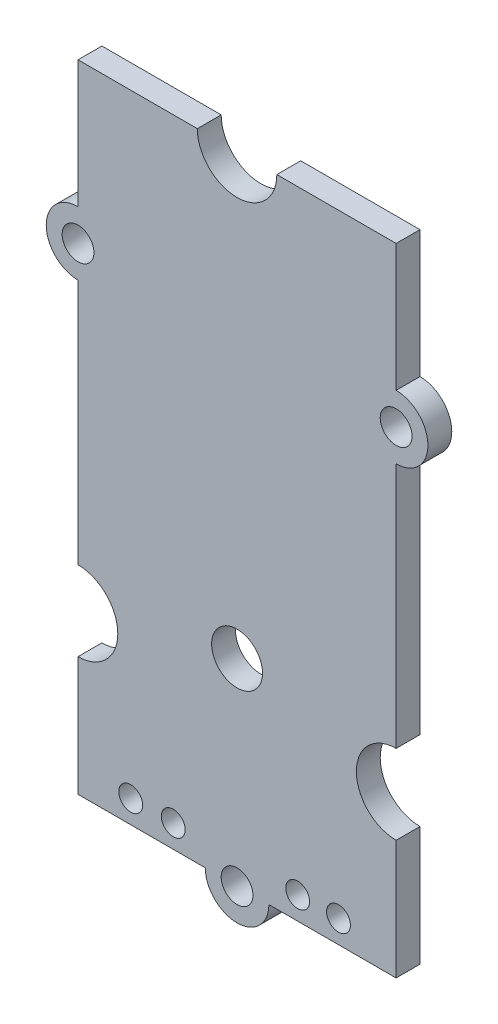
ISO-10303-21;
HEADER;
FILE_DESCRIPTION(('STEP AP214'),'2;1');
FILE_NAME('part.step','',(''),(''),'','','');
FILE_SCHEMA(('AUTOMOTIVE_DESIGN { 1 0 10303 214 1 1 1 1 }'));
ENDSEC;
DATA;
#1=APPLICATION_CONTEXT('core data for automotive mechanical design processes');
#2=APPLICATION_PROTOCOL_DEFINITION('international standard','automotive_design',2000,#1);
#3=PRODUCT_CONTEXT('',#1,'mechanical');
#4=PRODUCT('Part','Part','',(#3));
#5=PRODUCT_RELATED_PRODUCT_CATEGORY('part','',(#4));
#6=PRODUCT_DEFINITION_FORMATION('','',#4);
#7=PRODUCT_DEFINITION_CONTEXT('part definition',#1,'design');
#8=PRODUCT_DEFINITION('design','',#6,#7);
#9=PRODUCT_DEFINITION_SHAPE('','',#8);
#10=(LENGTH_UNIT() NAMED_UNIT(*) SI_UNIT(.MILLI.,.METRE.));
#11=(NAMED_UNIT(*) PLANE_ANGLE_UNIT() SI_UNIT($,.RADIAN.));
#12=(NAMED_UNIT(*) SI_UNIT($,.STERADIAN.) SOLID_ANGLE_UNIT());
#13=UNCERTAINTY_MEASURE_WITH_UNIT(LENGTH_MEASURE(1.E-05),#10,'distance_accuracy_value','');
#14=(GEOMETRIC_REPRESENTATION_CONTEXT(3) GLOBAL_UNCERTAINTY_ASSIGNED_CONTEXT((#13)) GLOBAL_UNIT_ASSIGNED_CONTEXT((#10,
#11,#12)) REPRESENTATION_CONTEXT('',''));
#15=CARTESIAN_POINT('',(0.,0.,0.));
#16=DIRECTION('',(0.,0.,1.));
#17=DIRECTION('',(1.,0.,0.));
#18=AXIS2_PLACEMENT_3D('',#15,#16,#17);
#19=CARTESIAN_POINT('',(-10.,0.,1.5));
#20=DIRECTION('',(1.,0.,0.));
#21=DIRECTION('',(0.,0.,-1.));
#22=AXIS2_PLACEMENT_3D('',#19,#20,#21);
#23=PLANE('',#22);
#24=DIRECTION('',(0.,-1.,0.));
#25=VECTOR('',#24,1.);
#26=CARTESIAN_POINT('',(-10.,0.,0.));
#27=LINE('',#26,#25);
#28=CARTESIAN_POINT('',(-10.,7.5,0.));
#29=VERTEX_POINT('',#28);
#30=CARTESIAN_POINT('',(-10.,0.,0.));
#31=VERTEX_POINT('',#30);
#32=EDGE_CURVE('E178',#29,#31,#27,.T.);
#33=ORIENTED_EDGE('',*,*,#32,.T.);
#34=DIRECTION('',(0.,0.,-1.));
#35=VECTOR('',#34,1.);
#36=CARTESIAN_POINT('',(-10.,0.,1.5));
#37=LINE('',#36,#35);
#38=CARTESIAN_POINT('',(-10.,0.,1.5));
#39=VERTEX_POINT('',#38);
#40=EDGE_CURVE('E11',#39,#31,#37,.T.);
#41=ORIENTED_EDGE('',*,*,#40,.F.);
#42=DIRECTION('',(0.,-1.,0.));
#43=VECTOR('',#42,1.);
#44=CARTESIAN_POINT('',(-10.,0.,1.5));
#45=LINE('',#44,#43);
#46=CARTESIAN_POINT('',(-10.,7.5,1.5));
#47=VERTEX_POINT('',#46);
#48=EDGE_CURVE('E209',#47,#39,#45,.T.);
#49=ORIENTED_EDGE('',*,*,#48,.F.);
#50=DIRECTION('',(0.,0.,-1.));
#51=VECTOR('',#50,1.);
#52=CARTESIAN_POINT('',(-10.,7.5,1.5));
#53=LINE('',#52,#51);
#54=EDGE_CURVE('E174',#47,#29,#53,.T.);
#55=ORIENTED_EDGE('',*,*,#54,.T.);
#56=EDGE_LOOP('',(#33,#41,#49,#55));
#57=FACE_BOUND('',#56,.T.);
#58=ADVANCED_FACE('F34',(#57),#23,.F.);
#59=CARTESIAN_POINT('',(-10.,0.,1.5));
#60=DIRECTION('',(0.,1.,0.));
#61=DIRECTION('',(0.,0.,1.));
#62=AXIS2_PLACEMENT_3D('',#59,#60,#61);
#63=PLANE('',#62);
#64=DIRECTION('',(1.,0.,0.));
#65=VECTOR('',#64,1.);
#66=CARTESIAN_POINT('',(-10.,0.,0.));
#67=LINE('',#66,#65);
#68=CARTESIAN_POINT('',(-2.,0.,0.));
#69=VERTEX_POINT('',#68);
#70=EDGE_CURVE('E181',#31,#69,#67,.T.);
#71=ORIENTED_EDGE('',*,*,#70,.T.);
#72=DIRECTION('',(0.,0.,-1.));
#73=VECTOR('',#72,1.);
#74=CARTESIAN_POINT('',(-2.,0.,1.5));
#75=LINE('',#74,#73);
#76=CARTESIAN_POINT('',(-2.,0.,1.5));
#77=VERTEX_POINT('',#76);
#78=EDGE_CURVE('E42',#77,#69,#75,.T.);
#79=ORIENTED_EDGE('',*,*,#78,.F.);
#80=DIRECTION('',(1.,0.,0.));
#81=VECTOR('',#80,1.);
#82=CARTESIAN_POINT('',(-10.,0.,1.5));
#83=LINE('',#82,#81);
#84=EDGE_CURVE('E117',#39,#77,#83,.T.);
#85=ORIENTED_EDGE('',*,*,#84,.F.);
#86=ORIENTED_EDGE('',*,*,#40,.T.);
#87=EDGE_LOOP('',(#71,#79,#85,#86));
#88=FACE_BOUND('',#87,.T.);
#89=ADVANCED_FACE('F308',(#88),#63,.F.);
#90=CARTESIAN_POINT('',(0.,0.,1.5));
#91=DIRECTION('',(0.,0.,-1.));
#92=DIRECTION('',(-1.,0.,0.));
#93=AXIS2_PLACEMENT_3D('',#90,#91,#92);
#94=CYLINDRICAL_SURFACE('',#93,2.);
#95=CARTESIAN_POINT('',(0.,0.,0.));
#96=DIRECTION('',(0.,0.,1.));
#97=DIRECTION('',(1.,0.,0.));
#98=AXIS2_PLACEMENT_3D('',#95,#96,#97);
#99=CIRCLE('',#98,2.);
#100=CARTESIAN_POINT('',(2.,0.,0.));
#101=VERTEX_POINT('',#100);
#102=EDGE_CURVE('E184',#69,#101,#99,.T.);
#103=ORIENTED_EDGE('',*,*,#102,.T.);
#104=DIRECTION('',(0.,0.,-1.));
#105=VECTOR('',#104,1.);
#106=CARTESIAN_POINT('',(2.,0.,1.5));
#107=LINE('',#106,#105);
#108=CARTESIAN_POINT('',(2.,0.,1.5));
#109=VERTEX_POINT('',#108);
#110=EDGE_CURVE('E240',#109,#101,#107,.T.);
#111=ORIENTED_EDGE('',*,*,#110,.F.);
#112=CARTESIAN_POINT('',(0.,0.,1.5));
#113=DIRECTION('',(0.,0.,1.));
#114=DIRECTION('',(1.,0.,0.));
#115=AXIS2_PLACEMENT_3D('',#112,#113,#114);
#116=CIRCLE('',#115,2.);
#117=EDGE_CURVE('E248',#77,#109,#116,.T.);
#118=ORIENTED_EDGE('',*,*,#117,.F.);
#119=ORIENTED_EDGE('',*,*,#78,.T.);
#120=EDGE_LOOP('',(#103,#111,#118,#119));
#121=FACE_BOUND('',#120,.T.);
#122=ADVANCED_FACE('F246',(#121),#94,.T.);
#123=CARTESIAN_POINT('',(10.,0.,1.5));
#124=DIRECTION('',(0.,1.,0.));
#125=DIRECTION('',(0.,0.,1.));
#126=AXIS2_PLACEMENT_3D('',#123,#124,#125);
#127=PLANE('',#126);
#128=DIRECTION('',(1.,0.,0.));
#129=VECTOR('',#128,1.);
#130=CARTESIAN_POINT('',(10.,0.,0.));
#131=LINE('',#130,#129);
#132=CARTESIAN_POINT('',(10.,0.,0.));
#133=VERTEX_POINT('',#132);
#134=EDGE_CURVE('E186',#101,#133,#131,.T.);
#135=ORIENTED_EDGE('',*,*,#134,.T.);
#136=DIRECTION('',(0.,0.,-1.));
#137=VECTOR('',#136,1.);
#138=CARTESIAN_POINT('',(10.,0.,1.5));
#139=LINE('',#138,#137);
#140=CARTESIAN_POINT('',(10.,0.,1.5));
#141=VERTEX_POINT('',#140);
#142=EDGE_CURVE('E237',#141,#133,#139,.T.);
#143=ORIENTED_EDGE('',*,*,#142,.F.);
#144=DIRECTION('',(1.,0.,0.));
#145=VECTOR('',#144,1.);
#146=CARTESIAN_POINT('',(10.,0.,1.5));
#147=LINE('',#146,#145);
#148=EDGE_CURVE('E266',#109,#141,#147,.T.);
#149=ORIENTED_EDGE('',*,*,#148,.F.);
#150=ORIENTED_EDGE('',*,*,#110,.T.);
#151=EDGE_LOOP('',(#135,#143,#149,#150));
#152=FACE_BOUND('',#151,.T.);
#153=ADVANCED_FACE('F257',(#152),#127,.F.);
#154=CARTESIAN_POINT('',(10.,0.,1.5));
#155=DIRECTION('',(-1.,0.,0.));
#156=DIRECTION('',(0.,0.,1.));
#157=AXIS2_PLACEMENT_3D('',#154,#155,#156);
#158=PLANE('',#157);
#159=DIRECTION('',(0.,1.,0.));
#160=VECTOR('',#159,1.);
#161=CARTESIAN_POINT('',(10.,0.,0.));
#162=LINE('',#161,#160);
#163=CARTESIAN_POINT('',(10.,7.5,0.));
#164=VERTEX_POINT('',#163);
#165=EDGE_CURVE('E188',#133,#164,#162,.T.);
#166=ORIENTED_EDGE('',*,*,#165,.T.);
#167=DIRECTION('',(0.,0.,-1.));
#168=VECTOR('',#167,1.);
#169=CARTESIAN_POINT('',(10.,7.5,1.5));
#170=LINE('',#169,#168);
#171=CARTESIAN_POINT('',(10.,7.5,1.5));
#172=VERTEX_POINT('',#171);
#173=EDGE_CURVE('E234',#172,#164,#170,.T.);
#174=ORIENTED_EDGE('',*,*,#173,.F.);
#175=DIRECTION('',(0.,1.,0.));
#176=VECTOR('',#175,1.);
#177=CARTESIAN_POINT('',(10.,0.,1.5));
#178=LINE('',#177,#176);
#179=EDGE_CURVE('E263',#141,#172,#178,.T.);
#180=ORIENTED_EDGE('',*,*,#179,.F.);
#181=ORIENTED_EDGE('',*,*,#142,.T.);
#182=EDGE_LOOP('',(#166,#174,#180,#181));
#183=FACE_BOUND('',#182,.T.);
#184=ADVANCED_FACE('F261',(#183),#158,.F.);
#185=CARTESIAN_POINT('',(10.,10.,1.5));
#186=DIRECTION('',(0.,0.,-1.));
#187=DIRECTION('',(-1.,0.,0.));
#188=AXIS2_PLACEMENT_3D('',#185,#186,#187);
#189=CYLINDRICAL_SURFACE('',#188,2.5);
#190=CARTESIAN_POINT('',(10.,10.,0.));
#191=DIRECTION('',(0.,0.,-1.));
#192=DIRECTION('',(1.,0.,0.));
#193=AXIS2_PLACEMENT_3D('',#190,#191,#192);
#194=CIRCLE('',#193,2.5);
#195=CARTESIAN_POINT('',(10.,12.5,0.));
#196=VERTEX_POINT('',#195);
#197=EDGE_CURVE('E190',#164,#196,#194,.T.);
#198=ORIENTED_EDGE('',*,*,#197,.T.);
#199=DIRECTION('',(0.,0.,-1.));
#200=VECTOR('',#199,1.);
#201=CARTESIAN_POINT('',(10.,12.5,1.5));
#202=LINE('',#201,#200);
#203=CARTESIAN_POINT('',(10.,12.5,1.5));
#204=VERTEX_POINT('',#203);
#205=EDGE_CURVE('E231',#204,#196,#202,.T.);
#206=ORIENTED_EDGE('',*,*,#205,.F.);
#207=CARTESIAN_POINT('',(10.,10.,1.5));
#208=DIRECTION('',(0.,0.,-1.));
#209=DIRECTION('',(1.,0.,0.));
#210=AXIS2_PLACEMENT_3D('',#207,#208,#209);
#211=CIRCLE('',#210,2.5);
#212=EDGE_CURVE('E265',#172,#204,#211,.T.);
#213=ORIENTED_EDGE('',*,*,#212,.F.);
#214=ORIENTED_EDGE('',*,*,#173,.T.);
#215=EDGE_LOOP('',(#198,#206,#213,#214));
#216=FACE_BOUND('',#215,.T.);
#217=ADVANCED_FACE('F321',(#216),#189,.F.);
#218=CARTESIAN_POINT('',(10.,12.5,1.5));
#219=DIRECTION('',(-1.,0.,0.));
#220=DIRECTION('',(0.,0.,1.));
#221=AXIS2_PLACEMENT_3D('',#218,#219,#220);
#222=PLANE('',#221);
#223=DIRECTION('',(0.,1.,0.));
#224=VECTOR('',#223,1.);
#225=CARTESIAN_POINT('',(10.,12.5,0.));
#226=LINE('',#225,#224);
#227=CARTESIAN_POINT('',(10.,28.,0.));
#228=VERTEX_POINT('',#227);
#229=EDGE_CURVE('E192',#196,#228,#226,.T.);
#230=ORIENTED_EDGE('',*,*,#229,.T.);
#231=DIRECTION('',(0.,0.,-1.));
#232=VECTOR('',#231,1.);
#233=CARTESIAN_POINT('',(10.,28.,1.5));
#234=LINE('',#233,#232);
#235=CARTESIAN_POINT('',(10.,28.,1.5));
#236=VERTEX_POINT('',#235);
#237=EDGE_CURVE('E228',#236,#228,#234,.T.);
#238=ORIENTED_EDGE('',*,*,#237,.F.);
#239=DIRECTION('',(0.,1.,0.));
#240=VECTOR('',#239,1.);
#241=CARTESIAN_POINT('',(10.,12.5,1.5));
#242=LINE('',#241,#240);
#243=EDGE_CURVE('E268',#204,#236,#242,.T.);
#244=ORIENTED_EDGE('',*,*,#243,.F.);
#245=ORIENTED_EDGE('',*,*,#205,.T.);
#246=EDGE_LOOP('',(#230,#238,#244,#245));
#247=FACE_BOUND('',#246,.T.);
#248=ADVANCED_FACE('F324',(#247),#222,.F.);
#249=CARTESIAN_POINT('',(10.,30.,1.5));
#250=DIRECTION('',(0.,0.,-1.));
#251=DIRECTION('',(-1.,0.,0.));
#252=AXIS2_PLACEMENT_3D('',#249,#250,#251);
#253=CYLINDRICAL_SURFACE('',#252,2.);
#254=CARTESIAN_POINT('',(10.,30.,0.));
#255=DIRECTION('',(0.,0.,1.));
#256=DIRECTION('',(-1.,0.,0.));
#257=AXIS2_PLACEMENT_3D('',#254,#255,#256);
#258=CIRCLE('',#257,2.);
#259=CARTESIAN_POINT('',(10.,32.,0.));
#260=VERTEX_POINT('',#259);
#261=EDGE_CURVE('E194',#228,#260,#258,.T.);
#262=ORIENTED_EDGE('',*,*,#261,.T.);
#263=DIRECTION('',(0.,0.,-1.));
#264=VECTOR('',#263,1.);
#265=CARTESIAN_POINT('',(10.,32.,1.5));
#266=LINE('',#265,#264);
#267=CARTESIAN_POINT('',(10.,32.,1.5));
#268=VERTEX_POINT('',#267);
#269=EDGE_CURVE('E225',#268,#260,#266,.T.);
#270=ORIENTED_EDGE('',*,*,#269,.F.);
#271=CARTESIAN_POINT('',(10.,30.,1.5));
#272=DIRECTION('',(0.,0.,1.));
#273=DIRECTION('',(-1.,0.,0.));
#274=AXIS2_PLACEMENT_3D('',#271,#272,#273);
#275=CIRCLE('',#274,2.);
#276=EDGE_CURVE('E274',#236,#268,#275,.T.);
#277=ORIENTED_EDGE('',*,*,#276,.F.);
#278=ORIENTED_EDGE('',*,*,#237,.T.);
#279=EDGE_LOOP('',(#262,#270,#277,#278));
#280=FACE_BOUND('',#279,.T.);
#281=ADVANCED_FACE('F328',(#280),#253,.T.);
#282=CARTESIAN_POINT('',(10.,40.,1.5));
#283=DIRECTION('',(-1.,0.,0.));
#284=DIRECTION('',(0.,0.,1.));
#285=AXIS2_PLACEMENT_3D('',#282,#283,#284);
#286=PLANE('',#285);
#287=DIRECTION('',(0.,1.,0.));
#288=VECTOR('',#287,1.);
#289=CARTESIAN_POINT('',(10.,40.,0.));
#290=LINE('',#289,#288);
#291=CARTESIAN_POINT('',(10.,40.,0.));
#292=VERTEX_POINT('',#291);
#293=EDGE_CURVE('E196',#260,#292,#290,.T.);
#294=ORIENTED_EDGE('',*,*,#293,.T.);
#295=DIRECTION('',(0.,0.,-1.));
#296=VECTOR('',#295,1.);
#297=CARTESIAN_POINT('',(10.,40.,1.5));
#298=LINE('',#297,#296);
#299=CARTESIAN_POINT('',(10.,40.,1.5));
#300=VERTEX_POINT('',#299);
#301=EDGE_CURVE('E222',#300,#292,#298,.T.);
#302=ORIENTED_EDGE('',*,*,#301,.F.);
#303=DIRECTION('',(0.,1.,0.));
#304=VECTOR('',#303,1.);
#305=CARTESIAN_POINT('',(10.,40.,1.5));
#306=LINE('',#305,#304);
#307=EDGE_CURVE('E276',#268,#300,#306,.T.);
#308=ORIENTED_EDGE('',*,*,#307,.F.);
#309=ORIENTED_EDGE('',*,*,#269,.T.);
#310=EDGE_LOOP('',(#294,#302,#308,#309));
#311=FACE_BOUND('',#310,.T.);
#312=ADVANCED_FACE('F332',(#311),#286,.F.);
#313=CARTESIAN_POINT('',(10.,40.,1.5));
#314=DIRECTION('',(0.,-1.,0.));
#315=DIRECTION('',(0.,0.,-1.));
#316=AXIS2_PLACEMENT_3D('',#313,#314,#315);
#317=PLANE('',#316);
#318=DIRECTION('',(-1.,0.,0.));
#319=VECTOR('',#318,1.);
#320=CARTESIAN_POINT('',(10.,40.,0.));
#321=LINE('',#320,#319);
#322=CARTESIAN_POINT('',(2.5,40.,0.));
#323=VERTEX_POINT('',#322);
#324=EDGE_CURVE('E198',#292,#323,#321,.T.);
#325=ORIENTED_EDGE('',*,*,#324,.T.);
#326=DIRECTION('',(0.,0.,-1.));
#327=VECTOR('',#326,1.);
#328=CARTESIAN_POINT('',(2.5,40.,1.5));
#329=LINE('',#328,#327);
#330=CARTESIAN_POINT('',(2.5,40.,1.5));
#331=VERTEX_POINT('',#330);
#332=EDGE_CURVE('E219',#331,#323,#329,.T.);
#333=ORIENTED_EDGE('',*,*,#332,.F.);
#334=DIRECTION('',(-1.,0.,0.));
#335=VECTOR('',#334,1.);
#336=CARTESIAN_POINT('',(10.,40.,1.5));
#337=LINE('',#336,#335);
#338=EDGE_CURVE('E278',#300,#331,#337,.T.);
#339=ORIENTED_EDGE('',*,*,#338,.F.);
#340=ORIENTED_EDGE('',*,*,#301,.T.);
#341=EDGE_LOOP('',(#325,#333,#339,#340));
#342=FACE_BOUND('',#341,.T.);
#343=ADVANCED_FACE('F336',(#342),#317,.F.);
#344=CARTESIAN_POINT('',(0.,40.,1.5));
#345=DIRECTION('',(0.,0.,-1.));
#346=DIRECTION('',(-1.,0.,0.));
#347=AXIS2_PLACEMENT_3D('',#344,#345,#346);
#348=CYLINDRICAL_SURFACE('',#347,2.5);
#349=CARTESIAN_POINT('',(0.,40.,0.));
#350=DIRECTION('',(0.,0.,-1.));
#351=DIRECTION('',(1.,0.,0.));
#352=AXIS2_PLACEMENT_3D('',#349,#350,#351);
#353=CIRCLE('',#352,2.5);
#354=CARTESIAN_POINT('',(-2.5,40.,0.));
#355=VERTEX_POINT('',#354);
#356=EDGE_CURVE('E200',#323,#355,#353,.T.);
#357=ORIENTED_EDGE('',*,*,#356,.T.);
#358=DIRECTION('',(0.,0.,-1.));
#359=VECTOR('',#358,1.);
#360=CARTESIAN_POINT('',(-2.5,40.,1.5));
#361=LINE('',#360,#359);
#362=CARTESIAN_POINT('',(-2.5,40.,1.5));
#363=VERTEX_POINT('',#362);
#364=EDGE_CURVE('E216',#363,#355,#361,.T.);
#365=ORIENTED_EDGE('',*,*,#364,.F.);
#366=CARTESIAN_POINT('',(0.,40.,1.5));
#367=DIRECTION('',(0.,0.,-1.));
#368=DIRECTION('',(1.,0.,0.));
#369=AXIS2_PLACEMENT_3D('',#366,#367,#368);
#370=CIRCLE('',#369,2.5);
#371=EDGE_CURVE('E280',#331,#363,#370,.T.);
#372=ORIENTED_EDGE('',*,*,#371,.F.);
#373=ORIENTED_EDGE('',*,*,#332,.T.);
#374=EDGE_LOOP('',(#357,#365,#372,#373));
#375=FACE_BOUND('',#374,.T.);
#376=ADVANCED_FACE('F340',(#375),#348,.F.);
#377=CARTESIAN_POINT('',(-10.,40.,1.5));
#378=DIRECTION('',(0.,-1.,0.));
#379=DIRECTION('',(0.,0.,-1.));
#380=AXIS2_PLACEMENT_3D('',#377,#378,#379);
#381=PLANE('',#380);
#382=DIRECTION('',(-1.,0.,0.));
#383=VECTOR('',#382,1.);
#384=CARTESIAN_POINT('',(-10.,40.,0.));
#385=LINE('',#384,#383);
#386=CARTESIAN_POINT('',(-10.,40.,0.));
#387=VERTEX_POINT('',#386);
#388=EDGE_CURVE('E202',#355,#387,#385,.T.);
#389=ORIENTED_EDGE('',*,*,#388,.T.);
#390=DIRECTION('',(0.,0.,-1.));
#391=VECTOR('',#390,1.);
#392=CARTESIAN_POINT('',(-10.,40.,1.5));
#393=LINE('',#392,#391);
#394=CARTESIAN_POINT('',(-10.,40.,1.5));
#395=VERTEX_POINT('',#394);
#396=EDGE_CURVE('E213',#395,#387,#393,.T.);
#397=ORIENTED_EDGE('',*,*,#396,.F.);
#398=DIRECTION('',(-1.,0.,0.));
#399=VECTOR('',#398,1.);
#400=CARTESIAN_POINT('',(-10.,40.,1.5));
#401=LINE('',#400,#399);
#402=EDGE_CURVE('E282',#363,#395,#401,.T.);
#403=ORIENTED_EDGE('',*,*,#402,.F.);
#404=ORIENTED_EDGE('',*,*,#364,.T.);
#405=EDGE_LOOP('',(#389,#397,#403,#404));
#406=FACE_BOUND('',#405,.T.);
#407=ADVANCED_FACE('F288',(#406),#381,.F.);
#408=CARTESIAN_POINT('',(-10.,40.,1.5));
#409=DIRECTION('',(1.,0.,0.));
#410=DIRECTION('',(0.,0.,-1.));
#411=AXIS2_PLACEMENT_3D('',#408,#409,#410);
#412=PLANE('',#411);
#413=DIRECTION('',(0.,-1.,0.));
#414=VECTOR('',#413,1.);
#415=CARTESIAN_POINT('',(-10.,40.,0.));
#416=LINE('',#415,#414);
#417=CARTESIAN_POINT('',(-10.,32.,0.));
#418=VERTEX_POINT('',#417);
#419=EDGE_CURVE('E204',#387,#418,#416,.T.);
#420=ORIENTED_EDGE('',*,*,#419,.T.);
#421=DIRECTION('',(0.,0.,-1.));
#422=VECTOR('',#421,1.);
#423=CARTESIAN_POINT('',(-10.,32.,1.5));
#424=LINE('',#423,#422);
#425=CARTESIAN_POINT('',(-10.,32.,1.5));
#426=VERTEX_POINT('',#425);
#427=EDGE_CURVE('E169',#426,#418,#424,.T.);
#428=ORIENTED_EDGE('',*,*,#427,.F.);
#429=DIRECTION('',(0.,-1.,0.));
#430=VECTOR('',#429,1.);
#431=CARTESIAN_POINT('',(-10.,40.,1.5));
#432=LINE('',#431,#430);
#433=EDGE_CURVE('E160',#395,#426,#432,.T.);
#434=ORIENTED_EDGE('',*,*,#433,.F.);
#435=ORIENTED_EDGE('',*,*,#396,.T.);
#436=EDGE_LOOP('',(#420,#428,#434,#435));
#437=FACE_BOUND('',#436,.T.);
#438=ADVANCED_FACE('F292',(#437),#412,.F.);
#439=CARTESIAN_POINT('',(-10.,30.,1.5));
#440=DIRECTION('',(0.,0.,-1.));
#441=DIRECTION('',(-1.,0.,0.));
#442=AXIS2_PLACEMENT_3D('',#439,#440,#441);
#443=CYLINDRICAL_SURFACE('',#442,2.);
#444=CARTESIAN_POINT('',(-10.,30.,0.));
#445=DIRECTION('',(0.,0.,1.));
#446=DIRECTION('',(1.,0.,0.));
#447=AXIS2_PLACEMENT_3D('',#444,#445,#446);
#448=CIRCLE('',#447,2.);
#449=CARTESIAN_POINT('',(-10.,28.,0.));
#450=VERTEX_POINT('',#449);
#451=EDGE_CURVE('E168',#418,#450,#448,.T.);
#452=ORIENTED_EDGE('',*,*,#451,.T.);
#453=DIRECTION('',(0.,0.,-1.));
#454=VECTOR('',#453,1.);
#455=CARTESIAN_POINT('',(-10.,28.,1.5));
#456=LINE('',#455,#454);
#457=CARTESIAN_POINT('',(-10.,28.,1.5));
#458=VERTEX_POINT('',#457);
#459=EDGE_CURVE('E165',#458,#450,#456,.T.);
#460=ORIENTED_EDGE('',*,*,#459,.F.);
#461=CARTESIAN_POINT('',(-10.,30.,1.5));
#462=DIRECTION('',(0.,0.,1.));
#463=DIRECTION('',(1.,0.,0.));
#464=AXIS2_PLACEMENT_3D('',#461,#462,#463);
#465=CIRCLE('',#464,2.);
#466=EDGE_CURVE('E154',#426,#458,#465,.T.);
#467=ORIENTED_EDGE('',*,*,#466,.F.);
#468=ORIENTED_EDGE('',*,*,#427,.T.);
#469=EDGE_LOOP('',(#452,#460,#467,#468));
#470=FACE_BOUND('',#469,.T.);
#471=ADVANCED_FACE('F166',(#470),#443,.T.);
#472=CARTESIAN_POINT('',(-10.,12.5,1.5));
#473=DIRECTION('',(1.,0.,0.));
#474=DIRECTION('',(0.,0.,-1.));
#475=AXIS2_PLACEMENT_3D('',#472,#473,#474);
#476=PLANE('',#475);
#477=DIRECTION('',(0.,-1.,0.));
#478=VECTOR('',#477,1.);
#479=CARTESIAN_POINT('',(-10.,12.5,0.));
#480=LINE('',#479,#478);
#481=CARTESIAN_POINT('',(-10.,12.5,0.));
#482=VERTEX_POINT('',#481);
#483=EDGE_CURVE('E103',#450,#482,#480,.T.);
#484=ORIENTED_EDGE('',*,*,#483,.T.);
#485=DIRECTION('',(0.,0.,-1.));
#486=VECTOR('',#485,1.);
#487=CARTESIAN_POINT('',(-10.,12.5,1.5));
#488=LINE('',#487,#486);
#489=CARTESIAN_POINT('',(-10.,12.5,1.5));
#490=VERTEX_POINT('',#489);
#491=EDGE_CURVE('E170',#490,#482,#488,.T.);
#492=ORIENTED_EDGE('',*,*,#491,.F.);
#493=DIRECTION('',(0.,-1.,0.));
#494=VECTOR('',#493,1.);
#495=CARTESIAN_POINT('',(-10.,12.5,1.5));
#496=LINE('',#495,#494);
#497=EDGE_CURVE('E158',#458,#490,#496,.T.);
#498=ORIENTED_EDGE('',*,*,#497,.F.);
#499=ORIENTED_EDGE('',*,*,#459,.T.);
#500=EDGE_LOOP('',(#484,#492,#498,#499));
#501=FACE_BOUND('',#500,.T.);
#502=ADVANCED_FACE('F172',(#501),#476,.F.);
#503=CARTESIAN_POINT('',(-10.,10.,1.5));
#504=DIRECTION('',(0.,0.,-1.));
#505=DIRECTION('',(-1.,0.,0.));
#506=AXIS2_PLACEMENT_3D('',#503,#504,#505);
#507=CYLINDRICAL_SURFACE('',#506,2.5);
#508=CARTESIAN_POINT('',(-10.,10.,0.));
#509=DIRECTION('',(0.,0.,-1.));
#510=DIRECTION('',(-1.,0.,0.));
#511=AXIS2_PLACEMENT_3D('',#508,#509,#510);
#512=CIRCLE('',#511,2.5);
#513=EDGE_CURVE('E109',#482,#29,#512,.T.);
#514=ORIENTED_EDGE('',*,*,#513,.T.);
#515=ORIENTED_EDGE('',*,*,#54,.F.);
#516=CARTESIAN_POINT('',(-10.,10.,1.5));
#517=DIRECTION('',(0.,0.,-1.));
#518=DIRECTION('',(-1.,0.,0.));
#519=AXIS2_PLACEMENT_3D('',#516,#517,#518);
#520=CIRCLE('',#519,2.5);
#521=EDGE_CURVE('E50',#490,#47,#520,.T.);
#522=ORIENTED_EDGE('',*,*,#521,.F.);
#523=ORIENTED_EDGE('',*,*,#491,.T.);
#524=EDGE_LOOP('',(#514,#515,#522,#523));
#525=FACE_BOUND('',#524,.T.);
#526=ADVANCED_FACE('F296',(#525),#507,.F.);
#527=CARTESIAN_POINT('',(-10.,10.,1.5));
#528=DIRECTION('',(0.,0.,-1.));
#529=DIRECTION('',(-1.,0.,0.));
#530=AXIS2_PLACEMENT_3D('',#527,#528,#529);
#531=PLANE('',#530);
#532=CARTESIAN_POINT('',(0.,12.3952,1.5));
#533=DIRECTION('',(0.,0.,-1.));
#534=DIRECTION('',(-1.,0.,0.));
#535=AXIS2_PLACEMENT_3D('',#532,#533,#534);
#536=CIRCLE('',#535,1.59999999999999);
#537=CARTESIAN_POINT('',(-1.59999999999999,12.3952,1.5));
#538=VERTEX_POINT('',#537);
#539=EDGE_CURVE('E468',#538,#538,#536,.T.);
#540=ORIENTED_EDGE('',*,*,#539,.T.);
#541=EDGE_LOOP('',(#540));
#542=FACE_BOUND('',#541,.T.);
#543=CARTESIAN_POINT('',(-6.68895611814447,1.43514330399011,1.5));
#544=DIRECTION('',(0.,0.,1.));
#545=DIRECTION('',(1.,0.,0.));
#546=AXIS2_PLACEMENT_3D('',#543,#544,#545);
#547=CIRCLE('',#546,0.75);
#548=CARTESIAN_POINT('',(-5.93895611814447,1.43514330399011,1.5));
#549=VERTEX_POINT('',#548);
#550=EDGE_CURVE('E469',#549,#549,#547,.T.);
#551=ORIENTED_EDGE('',*,*,#550,.F.);
#552=EDGE_LOOP('',(#551));
#553=FACE_BOUND('',#552,.T.);
#554=CARTESIAN_POINT('',(-4.01251826844609,1.43514330399011,1.5));
#555=DIRECTION('',(0.,0.,1.));
#556=DIRECTION('',(1.,0.,0.));
#557=AXIS2_PLACEMENT_3D('',#554,#555,#556);
#558=CIRCLE('',#557,0.75);
#559=CARTESIAN_POINT('',(-3.26251826844609,1.43514330399011,1.5));
#560=VERTEX_POINT('',#559);
#561=EDGE_CURVE('E477',#560,#560,#558,.T.);
#562=ORIENTED_EDGE('',*,*,#561,.F.);
#563=EDGE_LOOP('',(#562));
#564=FACE_BOUND('',#563,.T.);
#565=CARTESIAN_POINT('',(3.809466202395,1.43514330399011,1.5));
#566=DIRECTION('',(0.,0.,1.));
#567=DIRECTION('',(1.,0.,0.));
#568=AXIS2_PLACEMENT_3D('',#565,#566,#567);
#569=CIRCLE('',#568,0.75);
#570=CARTESIAN_POINT('',(4.559466202395,1.43514330399011,1.5));
#571=VERTEX_POINT('',#570);
#572=EDGE_CURVE('E482',#571,#571,#569,.T.);
#573=ORIENTED_EDGE('',*,*,#572,.F.);
#574=EDGE_LOOP('',(#573));
#575=FACE_BOUND('',#574,.T.);
#576=CARTESIAN_POINT('',(6.3773731201034,1.43514330399011,1.5));
#577=DIRECTION('',(0.,0.,1.));
#578=DIRECTION('',(1.,0.,0.));
#579=AXIS2_PLACEMENT_3D('',#576,#577,#578);
#580=CIRCLE('',#579,0.75);
#581=CARTESIAN_POINT('',(7.1273731201034,1.43514330399011,1.5));
#582=VERTEX_POINT('',#581);
#583=EDGE_CURVE('E488',#582,#582,#580,.T.);
#584=ORIENTED_EDGE('',*,*,#583,.F.);
#585=EDGE_LOOP('',(#584));
#586=FACE_BOUND('',#585,.T.);
#587=CARTESIAN_POINT('',(0.,0.,1.5));
#588=DIRECTION('',(0.,0.,1.));
#589=DIRECTION('',(1.,0.,0.));
#590=AXIS2_PLACEMENT_3D('',#587,#588,#589);
#591=CIRCLE('',#590,1.);
#592=CARTESIAN_POINT('',(1.,0.,1.5));
#593=VERTEX_POINT('',#592);
#594=EDGE_CURVE('E494',#593,#593,#591,.T.);
#595=ORIENTED_EDGE('',*,*,#594,.F.);
#596=EDGE_LOOP('',(#595));
#597=FACE_BOUND('',#596,.T.);
#598=CARTESIAN_POINT('',(10.,30.,1.5));
#599=DIRECTION('',(0.,0.,1.));
#600=DIRECTION('',(-1.,0.,0.));
#601=AXIS2_PLACEMENT_3D('',#598,#599,#600);
#602=CIRCLE('',#601,1.);
#603=CARTESIAN_POINT('',(9.,30.,1.5));
#604=VERTEX_POINT('',#603);
#605=EDGE_CURVE('E500',#604,#604,#602,.T.);
#606=ORIENTED_EDGE('',*,*,#605,.F.);
#607=EDGE_LOOP('',(#606));
#608=FACE_BOUND('',#607,.T.);
#609=CARTESIAN_POINT('',(-10.,30.,1.5));
#610=DIRECTION('',(0.,0.,1.));
#611=DIRECTION('',(1.,0.,0.));
#612=AXIS2_PLACEMENT_3D('',#609,#610,#611);
#613=CIRCLE('',#612,1.);
#614=CARTESIAN_POINT('',(-9.,30.,1.5));
#615=VERTEX_POINT('',#614);
#616=EDGE_CURVE('E506',#615,#615,#613,.T.);
#617=ORIENTED_EDGE('',*,*,#616,.F.);
#618=EDGE_LOOP('',(#617));
#619=FACE_BOUND('',#618,.T.);
#620=ORIENTED_EDGE('',*,*,#48,.T.);
#621=ORIENTED_EDGE('',*,*,#84,.T.);
#622=ORIENTED_EDGE('',*,*,#117,.T.);
#623=ORIENTED_EDGE('',*,*,#148,.T.);
#624=ORIENTED_EDGE('',*,*,#179,.T.);
#625=ORIENTED_EDGE('',*,*,#212,.T.);
#626=ORIENTED_EDGE('',*,*,#243,.T.);
#627=ORIENTED_EDGE('',*,*,#276,.T.);
#628=ORIENTED_EDGE('',*,*,#307,.T.);
#629=ORIENTED_EDGE('',*,*,#338,.T.);
#630=ORIENTED_EDGE('',*,*,#371,.T.);
#631=ORIENTED_EDGE('',*,*,#402,.T.);
#632=ORIENTED_EDGE('',*,*,#433,.T.);
#633=ORIENTED_EDGE('',*,*,#466,.T.);
#634=ORIENTED_EDGE('',*,*,#497,.T.);
#635=ORIENTED_EDGE('',*,*,#521,.T.);
#636=EDGE_LOOP('',(#620,#621,#622,#623,#624,#625,#626,#627,#628,#629,#630,#631,#632,#633,#634,#635));
#637=FACE_BOUND('',#636,.T.);
#638=ADVANCED_FACE('F156',(#542,#553,#564,#575,#586,#597,#608,#619,#637),#531,.F.);
#639=CARTESIAN_POINT('',(-10.,10.,0.));
#640=DIRECTION('',(0.,0.,-1.));
#641=DIRECTION('',(-1.,0.,0.));
#642=AXIS2_PLACEMENT_3D('',#639,#640,#641);
#643=PLANE('',#642);
#644=CARTESIAN_POINT('',(0.,12.3952,0.));
#645=DIRECTION('',(0.,0.,-1.));
#646=DIRECTION('',(-1.,0.,0.));
#647=AXIS2_PLACEMENT_3D('',#644,#645,#646);
#648=CIRCLE('',#647,1.59999999999999);
#649=CARTESIAN_POINT('',(-1.59999999999999,12.3952,0.));
#650=VERTEX_POINT('',#649);
#651=EDGE_CURVE('E465',#650,#650,#648,.T.);
#652=ORIENTED_EDGE('',*,*,#651,.F.);
#653=EDGE_LOOP('',(#652));
#654=FACE_BOUND('',#653,.T.);
#655=CARTESIAN_POINT('',(-6.68895611814447,1.43514330399011,0.));
#656=DIRECTION('',(0.,0.,1.));
#657=DIRECTION('',(1.,0.,0.));
#658=AXIS2_PLACEMENT_3D('',#655,#656,#657);
#659=CIRCLE('',#658,0.75);
#660=CARTESIAN_POINT('',(-5.93895611814447,1.43514330399011,0.));
#661=VERTEX_POINT('',#660);
#662=EDGE_CURVE('E472',#661,#661,#659,.T.);
#663=ORIENTED_EDGE('',*,*,#662,.T.);
#664=EDGE_LOOP('',(#663));
#665=FACE_BOUND('',#664,.T.);
#666=CARTESIAN_POINT('',(-4.01251826844609,1.43514330399011,0.));
#667=DIRECTION('',(0.,0.,1.));
#668=DIRECTION('',(1.,0.,0.));
#669=AXIS2_PLACEMENT_3D('',#666,#667,#668);
#670=CIRCLE('',#669,0.75);
#671=CARTESIAN_POINT('',(-3.26251826844609,1.43514330399011,0.));
#672=VERTEX_POINT('',#671);
#673=EDGE_CURVE('E479',#672,#672,#670,.T.);
#674=ORIENTED_EDGE('',*,*,#673,.T.);
#675=EDGE_LOOP('',(#674));
#676=FACE_BOUND('',#675,.T.);
#677=CARTESIAN_POINT('',(3.809466202395,1.43514330399011,0.));
#678=DIRECTION('',(0.,0.,1.));
#679=DIRECTION('',(1.,0.,0.));
#680=AXIS2_PLACEMENT_3D('',#677,#678,#679);
#681=CIRCLE('',#680,0.75);
#682=CARTESIAN_POINT('',(4.559466202395,1.43514330399011,0.));
#683=VERTEX_POINT('',#682);
#684=EDGE_CURVE('E485',#683,#683,#681,.T.);
#685=ORIENTED_EDGE('',*,*,#684,.T.);
#686=EDGE_LOOP('',(#685));
#687=FACE_BOUND('',#686,.T.);
#688=CARTESIAN_POINT('',(6.3773731201034,1.43514330399011,0.));
#689=DIRECTION('',(0.,0.,1.));
#690=DIRECTION('',(1.,0.,0.));
#691=AXIS2_PLACEMENT_3D('',#688,#689,#690);
#692=CIRCLE('',#691,0.75);
#693=CARTESIAN_POINT('',(7.1273731201034,1.43514330399011,0.));
#694=VERTEX_POINT('',#693);
#695=EDGE_CURVE('E491',#694,#694,#692,.T.);
#696=ORIENTED_EDGE('',*,*,#695,.T.);
#697=EDGE_LOOP('',(#696));
#698=FACE_BOUND('',#697,.T.);
#699=CARTESIAN_POINT('',(0.,0.,0.));
#700=DIRECTION('',(0.,0.,1.));
#701=DIRECTION('',(1.,0.,0.));
#702=AXIS2_PLACEMENT_3D('',#699,#700,#701);
#703=CIRCLE('',#702,1.);
#704=CARTESIAN_POINT('',(1.,0.,0.));
#705=VERTEX_POINT('',#704);
#706=EDGE_CURVE('E497',#705,#705,#703,.T.);
#707=ORIENTED_EDGE('',*,*,#706,.T.);
#708=EDGE_LOOP('',(#707));
#709=FACE_BOUND('',#708,.T.);
#710=CARTESIAN_POINT('',(10.,30.,0.));
#711=DIRECTION('',(0.,0.,1.));
#712=DIRECTION('',(-1.,0.,0.));
#713=AXIS2_PLACEMENT_3D('',#710,#711,#712);
#714=CIRCLE('',#713,1.);
#715=CARTESIAN_POINT('',(9.,30.,0.));
#716=VERTEX_POINT('',#715);
#717=EDGE_CURVE('E503',#716,#716,#714,.T.);
#718=ORIENTED_EDGE('',*,*,#717,.T.);
#719=EDGE_LOOP('',(#718));
#720=FACE_BOUND('',#719,.T.);
#721=CARTESIAN_POINT('',(-10.,30.,0.));
#722=DIRECTION('',(0.,0.,1.));
#723=DIRECTION('',(1.,0.,0.));
#724=AXIS2_PLACEMENT_3D('',#721,#722,#723);
#725=CIRCLE('',#724,1.);
#726=CARTESIAN_POINT('',(-9.,30.,0.));
#727=VERTEX_POINT('',#726);
#728=EDGE_CURVE('E182',#727,#727,#725,.T.);
#729=ORIENTED_EDGE('',*,*,#728,.T.);
#730=EDGE_LOOP('',(#729));
#731=FACE_BOUND('',#730,.T.);
#732=ORIENTED_EDGE('',*,*,#32,.F.);
#733=ORIENTED_EDGE('',*,*,#513,.F.);
#734=ORIENTED_EDGE('',*,*,#483,.F.);
#735=ORIENTED_EDGE('',*,*,#451,.F.);
#736=ORIENTED_EDGE('',*,*,#419,.F.);
#737=ORIENTED_EDGE('',*,*,#388,.F.);
#738=ORIENTED_EDGE('',*,*,#356,.F.);
#739=ORIENTED_EDGE('',*,*,#324,.F.);
#740=ORIENTED_EDGE('',*,*,#293,.F.);
#741=ORIENTED_EDGE('',*,*,#261,.F.);
#742=ORIENTED_EDGE('',*,*,#229,.F.);
#743=ORIENTED_EDGE('',*,*,#197,.F.);
#744=ORIENTED_EDGE('',*,*,#165,.F.);
#745=ORIENTED_EDGE('',*,*,#134,.F.);
#746=ORIENTED_EDGE('',*,*,#102,.F.);
#747=ORIENTED_EDGE('',*,*,#70,.F.);
#748=EDGE_LOOP('',(#732,#733,#734,#735,#736,#737,#738,#739,#740,#741,#742,#743,#744,#745,#746,#747));
#749=FACE_BOUND('',#748,.T.);
#750=ADVANCED_FACE('F252',(#654,#665,#676,#687,#698,#709,#720,#731,#749),#643,.T.);
#751=CARTESIAN_POINT('',(-10.,30.,0.));
#752=DIRECTION('',(0.,0.,1.));
#753=DIRECTION('',(1.,0.,0.));
#754=AXIS2_PLACEMENT_3D('',#751,#752,#753);
#755=CYLINDRICAL_SURFACE('',#754,1.);
#756=ORIENTED_EDGE('',*,*,#728,.F.);
#757=EDGE_LOOP('',(#756));
#758=FACE_BOUND('',#757,.T.);
#759=ORIENTED_EDGE('',*,*,#616,.T.);
#760=EDGE_LOOP('',(#759));
#761=FACE_BOUND('',#760,.T.);
#762=ADVANCED_FACE('F368',(#758,#761),#755,.F.);
#763=CARTESIAN_POINT('',(10.,30.,0.));
#764=DIRECTION('',(0.,0.,1.));
#765=DIRECTION('',(1.,0.,0.));
#766=AXIS2_PLACEMENT_3D('',#763,#764,#765);
#767=CYLINDRICAL_SURFACE('',#766,1.);
#768=ORIENTED_EDGE('',*,*,#717,.F.);
#769=EDGE_LOOP('',(#768));
#770=FACE_BOUND('',#769,.T.);
#771=ORIENTED_EDGE('',*,*,#605,.T.);
#772=EDGE_LOOP('',(#771));
#773=FACE_BOUND('',#772,.T.);
#774=ADVANCED_FACE('F373',(#770,#773),#767,.F.);
#775=CARTESIAN_POINT('',(0.,0.,0.));
#776=DIRECTION('',(0.,0.,1.));
#777=DIRECTION('',(1.,0.,0.));
#778=AXIS2_PLACEMENT_3D('',#775,#776,#777);
#779=CYLINDRICAL_SURFACE('',#778,1.);
#780=ORIENTED_EDGE('',*,*,#706,.F.);
#781=EDGE_LOOP('',(#780));
#782=FACE_BOUND('',#781,.T.);
#783=ORIENTED_EDGE('',*,*,#594,.T.);
#784=EDGE_LOOP('',(#783));
#785=FACE_BOUND('',#784,.T.);
#786=ADVANCED_FACE('F385',(#782,#785),#779,.F.);
#787=CARTESIAN_POINT('',(6.3773731201034,1.43514330399011,0.));
#788=DIRECTION('',(0.,0.,1.));
#789=DIRECTION('',(1.,0.,0.));
#790=AXIS2_PLACEMENT_3D('',#787,#788,#789);
#791=CYLINDRICAL_SURFACE('',#790,0.75);
#792=ORIENTED_EDGE('',*,*,#695,.F.);
#793=EDGE_LOOP('',(#792));
#794=FACE_BOUND('',#793,.T.);
#795=ORIENTED_EDGE('',*,*,#583,.T.);
#796=EDGE_LOOP('',(#795));
#797=FACE_BOUND('',#796,.T.);
#798=ADVANCED_FACE('F395',(#794,#797),#791,.F.);
#799=CARTESIAN_POINT('',(3.809466202395,1.43514330399011,0.));
#800=DIRECTION('',(0.,0.,1.));
#801=DIRECTION('',(1.,0.,0.));
#802=AXIS2_PLACEMENT_3D('',#799,#800,#801);
#803=CYLINDRICAL_SURFACE('',#802,0.75);
#804=ORIENTED_EDGE('',*,*,#684,.F.);
#805=EDGE_LOOP('',(#804));
#806=FACE_BOUND('',#805,.T.);
#807=ORIENTED_EDGE('',*,*,#572,.T.);
#808=EDGE_LOOP('',(#807));
#809=FACE_BOUND('',#808,.T.);
#810=ADVANCED_FACE('F405',(#806,#809),#803,.F.);
#811=CARTESIAN_POINT('',(-4.01251826844609,1.43514330399011,0.));
#812=DIRECTION('',(0.,0.,1.));
#813=DIRECTION('',(1.,0.,0.));
#814=AXIS2_PLACEMENT_3D('',#811,#812,#813);
#815=CYLINDRICAL_SURFACE('',#814,0.75);
#816=ORIENTED_EDGE('',*,*,#673,.F.);
#817=EDGE_LOOP('',(#816));
#818=FACE_BOUND('',#817,.T.);
#819=ORIENTED_EDGE('',*,*,#561,.T.);
#820=EDGE_LOOP('',(#819));
#821=FACE_BOUND('',#820,.T.);
#822=ADVANCED_FACE('F415',(#818,#821),#815,.F.);
#823=CARTESIAN_POINT('',(-6.68895611814447,1.43514330399011,0.));
#824=DIRECTION('',(0.,0.,1.));
#825=DIRECTION('',(1.,0.,0.));
#826=AXIS2_PLACEMENT_3D('',#823,#824,#825);
#827=CYLINDRICAL_SURFACE('',#826,0.75);
#828=ORIENTED_EDGE('',*,*,#662,.F.);
#829=EDGE_LOOP('',(#828));
#830=FACE_BOUND('',#829,.T.);
#831=ORIENTED_EDGE('',*,*,#550,.T.);
#832=EDGE_LOOP('',(#831));
#833=FACE_BOUND('',#832,.T.);
#834=ADVANCED_FACE('F425',(#830,#833),#827,.F.);
#835=CARTESIAN_POINT('',(0.,12.3952,0.));
#836=DIRECTION('',(0.,0.,-1.));
#837=DIRECTION('',(-1.,0.,0.));
#838=AXIS2_PLACEMENT_3D('',#835,#836,#837);
#839=CYLINDRICAL_SURFACE('',#838,1.59999999999999);
#840=ORIENTED_EDGE('',*,*,#651,.T.);
#841=EDGE_LOOP('',(#840));
#842=FACE_BOUND('',#841,.T.);
#843=ORIENTED_EDGE('',*,*,#539,.F.);
#844=EDGE_LOOP('',(#843));
#845=FACE_BOUND('',#844,.T.);
#846=ADVANCED_FACE('F435',(#842,#845),#839,.F.);
#847=CLOSED_SHELL('',(#58,#89,#122,#153,#184,#217,#248,#281,#312,#343,#376,#407,#438,#471,#502,
#526,#638,#750,#762,#774,#786,#798,#810,#822,#834,#846));
#848=MANIFOLD_SOLID_BREP('B2',#847);
#849=ADVANCED_BREP_SHAPE_REPRESENTATION('',(#18,#848),#14);
#850=SHAPE_DEFINITION_REPRESENTATION(#9,#849);
ENDSEC;
END-ISO-10303-21;
